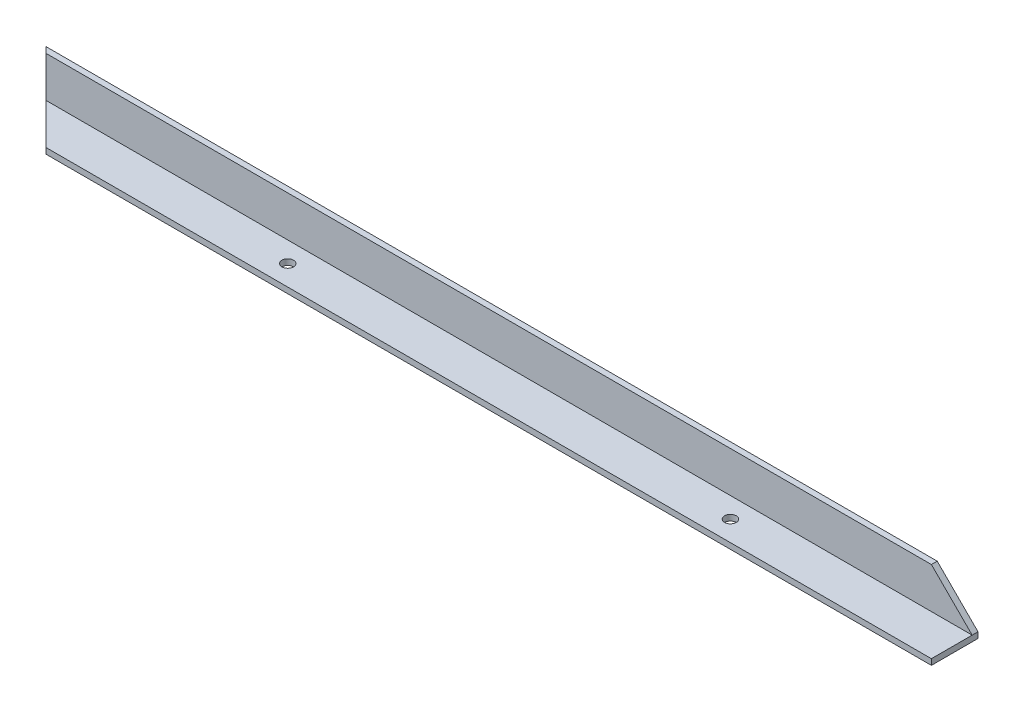
ISO-10303-21;
HEADER;
FILE_DESCRIPTION(('STEP AP214'),'2;1');
FILE_NAME('part.step','',(''),(''),'','','');
FILE_SCHEMA(('AUTOMOTIVE_DESIGN { 1 0 10303 214 1 1 1 1 }'));
ENDSEC;
DATA;
#1=APPLICATION_CONTEXT('core data for automotive mechanical design processes');
#2=APPLICATION_PROTOCOL_DEFINITION('international standard','automotive_design',2000,#1);
#3=PRODUCT_CONTEXT('',#1,'mechanical');
#4=PRODUCT('Part','Part','',(#3));
#5=PRODUCT_RELATED_PRODUCT_CATEGORY('part','',(#4));
#6=PRODUCT_DEFINITION_FORMATION('','',#4);
#7=PRODUCT_DEFINITION_CONTEXT('part definition',#1,'design');
#8=PRODUCT_DEFINITION('design','',#6,#7);
#9=PRODUCT_DEFINITION_SHAPE('','',#8);
#10=(LENGTH_UNIT() NAMED_UNIT(*) SI_UNIT(.MILLI.,.METRE.));
#11=(NAMED_UNIT(*) PLANE_ANGLE_UNIT() SI_UNIT($,.RADIAN.));
#12=(NAMED_UNIT(*) SI_UNIT($,.STERADIAN.) SOLID_ANGLE_UNIT());
#13=UNCERTAINTY_MEASURE_WITH_UNIT(LENGTH_MEASURE(1.E-05),#10,'distance_accuracy_value','');
#14=(GEOMETRIC_REPRESENTATION_CONTEXT(3) GLOBAL_UNCERTAINTY_ASSIGNED_CONTEXT((#13)) GLOBAL_UNIT_ASSIGNED_CONTEXT((#10,
#11,#12)) REPRESENTATION_CONTEXT('',''));
#15=CARTESIAN_POINT('',(0.,0.,0.));
#16=DIRECTION('',(0.,0.,1.));
#17=DIRECTION('',(1.,0.,0.));
#18=AXIS2_PLACEMENT_3D('',#15,#16,#17);
#19=CARTESIAN_POINT('',(0.,3.175,0.));
#20=DIRECTION('',(0.,-1.,0.));
#21=DIRECTION('',(0.,0.,-1.));
#22=AXIS2_PLACEMENT_3D('',#19,#20,#21);
#23=PLANE('',#22);
#24=CARTESIAN_POINT('',(-120.65,3.175,14.2874999999994));
#25=DIRECTION('',(0.,1.,0.));
#26=DIRECTION('',(0.,0.,-1.));
#27=AXIS2_PLACEMENT_3D('',#24,#25,#26);
#28=CIRCLE('',#27,3.17499999999997);
#29=CARTESIAN_POINT('',(-120.65,3.175,11.1124999999995));
#30=VERTEX_POINT('',#29);
#31=EDGE_CURVE('E239',#30,#30,#28,.T.);
#32=ORIENTED_EDGE('',*,*,#31,.F.);
#33=EDGE_LOOP('',(#32));
#34=FACE_BOUND('',#33,.T.);
#35=CARTESIAN_POINT('',(-361.95,3.175,14.2875));
#36=DIRECTION('',(0.,1.,0.));
#37=DIRECTION('',(0.,0.,1.));
#38=AXIS2_PLACEMENT_3D('',#35,#36,#37);
#39=CIRCLE('',#38,3.17499999999997);
#40=CARTESIAN_POINT('',(-361.95,3.175,17.4625));
#41=VERTEX_POINT('',#40);
#42=EDGE_CURVE('E243',#41,#41,#39,.T.);
#43=ORIENTED_EDGE('',*,*,#42,.F.);
#44=EDGE_LOOP('',(#43));
#45=FACE_BOUND('',#44,.T.);
#46=DIRECTION('',(1.,0.,0.));
#47=VECTOR('',#46,1.);
#48=CARTESIAN_POINT('',(-508.,3.175,3.175));
#49=LINE('',#48,#47);
#50=CARTESIAN_POINT('',(-504.825,3.175,3.175));
#51=VERTEX_POINT('',#50);
#52=CARTESIAN_POINT('',(0.,3.175,3.175));
#53=VERTEX_POINT('',#52);
#54=EDGE_CURVE('E109',#51,#53,#49,.T.);
#55=ORIENTED_EDGE('',*,*,#54,.F.);
#56=DIRECTION('',(0.707106781186551,0.,0.707106781186544));
#57=VECTOR('',#56,1.);
#58=CARTESIAN_POINT('',(-253.999999999997,3.175,254.));
#59=LINE('',#58,#57);
#60=CARTESIAN_POINT('',(-482.6,3.175,25.4));
#61=VERTEX_POINT('',#60);
#62=EDGE_CURVE('E151',#51,#61,#59,.T.);
#63=ORIENTED_EDGE('',*,*,#62,.T.);
#64=DIRECTION('',(1.,0.,0.));
#65=VECTOR('',#64,1.);
#66=CARTESIAN_POINT('',(0.,3.175,25.4));
#67=LINE('',#66,#65);
#68=CARTESIAN_POINT('',(0.,3.175,25.4));
#69=VERTEX_POINT('',#68);
#70=EDGE_CURVE('E117',#61,#69,#67,.T.);
#71=ORIENTED_EDGE('',*,*,#70,.T.);
#72=DIRECTION('',(0.,0.,-1.));
#73=VECTOR('',#72,1.);
#74=CARTESIAN_POINT('',(0.,3.175,0.));
#75=LINE('',#74,#73);
#76=EDGE_CURVE('E104',#69,#53,#75,.T.);
#77=ORIENTED_EDGE('',*,*,#76,.T.);
#78=EDGE_LOOP('',(#55,#63,#71,#77));
#79=FACE_BOUND('',#78,.T.);
#80=ADVANCED_FACE('F35',(#34,#45,#79),#23,.F.);
#81=CARTESIAN_POINT('',(0.,3.175,0.));
#82=DIRECTION('',(-1.,0.,0.));
#83=DIRECTION('',(0.,0.,1.));
#84=AXIS2_PLACEMENT_3D('',#81,#82,#83);
#85=PLANE('',#84);
#86=DIRECTION('',(0.,-1.,0.));
#87=VECTOR('',#86,1.);
#88=CARTESIAN_POINT('',(0.,3.175,0.));
#89=LINE('',#88,#87);
#90=CARTESIAN_POINT('',(0.,3.175,0.));
#91=VERTEX_POINT('',#90);
#92=CARTESIAN_POINT('',(0.,0.,0.));
#93=VERTEX_POINT('',#92);
#94=EDGE_CURVE('E106',#91,#93,#89,.T.);
#95=ORIENTED_EDGE('',*,*,#94,.F.);
#96=DIRECTION('',(0.,0.,1.));
#97=VECTOR('',#96,1.);
#98=CARTESIAN_POINT('',(0.,3.175,-19.05));
#99=LINE('',#98,#97);
#100=EDGE_CURVE('E92',#91,#53,#99,.T.);
#101=ORIENTED_EDGE('',*,*,#100,.T.);
#102=ORIENTED_EDGE('',*,*,#76,.F.);
#103=DIRECTION('',(0.,-1.,0.));
#104=VECTOR('',#103,1.);
#105=CARTESIAN_POINT('',(0.,3.175,25.4));
#106=LINE('',#105,#104);
#107=CARTESIAN_POINT('',(0.,0.,25.4));
#108=VERTEX_POINT('',#107);
#109=EDGE_CURVE('E121',#69,#108,#106,.T.);
#110=ORIENTED_EDGE('',*,*,#109,.T.);
#111=DIRECTION('',(0.,0.,-1.));
#112=VECTOR('',#111,1.);
#113=CARTESIAN_POINT('',(0.,0.,0.));
#114=LINE('',#113,#112);
#115=EDGE_CURVE('E127',#108,#93,#114,.T.);
#116=ORIENTED_EDGE('',*,*,#115,.T.);
#117=EDGE_LOOP('',(#95,#101,#102,#110,#116));
#118=FACE_BOUND('',#117,.T.);
#119=ADVANCED_FACE('F37',(#118),#85,.F.);
#120=CARTESIAN_POINT('',(0.,3.175,0.));
#121=DIRECTION('',(0.,0.,1.));
#122=DIRECTION('',(1.,0.,0.));
#123=AXIS2_PLACEMENT_3D('',#120,#121,#122);
#124=PLANE('',#123);
#125=DIRECTION('',(-1.,0.,0.));
#126=VECTOR('',#125,1.);
#127=CARTESIAN_POINT('',(-508.,25.4,0.));
#128=LINE('',#127,#126);
#129=CARTESIAN_POINT('',(-22.2250000000002,25.4,0.));
#130=VERTEX_POINT('',#129);
#131=CARTESIAN_POINT('',(-508.,25.4,0.));
#132=VERTEX_POINT('',#131);
#133=EDGE_CURVE('E129',#130,#132,#128,.T.);
#134=ORIENTED_EDGE('',*,*,#133,.F.);
#135=DIRECTION('',(0.707106781186551,-0.707106781186544,0.));
#136=VECTOR('',#135,1.);
#137=CARTESIAN_POINT('',(0.,3.175,0.));
#138=LINE('',#137,#136);
#139=EDGE_CURVE('E49',#130,#91,#138,.T.);
#140=ORIENTED_EDGE('',*,*,#139,.T.);
#141=ORIENTED_EDGE('',*,*,#94,.T.);
#142=DIRECTION('',(-1.,0.,0.));
#143=VECTOR('',#142,1.);
#144=CARTESIAN_POINT('',(0.,0.,0.));
#145=LINE('',#144,#143);
#146=CARTESIAN_POINT('',(-508.,0.,0.));
#147=VERTEX_POINT('',#146);
#148=EDGE_CURVE('E123',#93,#147,#145,.T.);
#149=ORIENTED_EDGE('',*,*,#148,.T.);
#150=DIRECTION('',(0.,-1.,0.));
#151=VECTOR('',#150,1.);
#152=CARTESIAN_POINT('',(-508.,3.175,0.));
#153=LINE('',#152,#151);
#154=EDGE_CURVE('E133',#132,#147,#153,.T.);
#155=ORIENTED_EDGE('',*,*,#154,.F.);
#156=EDGE_LOOP('',(#134,#140,#141,#149,#155));
#157=FACE_BOUND('',#156,.T.);
#158=ADVANCED_FACE('F141',(#157),#124,.F.);
#159=CARTESIAN_POINT('',(0.,3.175,25.4));
#160=DIRECTION('',(0.,0.,-1.));
#161=DIRECTION('',(-1.,0.,0.));
#162=AXIS2_PLACEMENT_3D('',#159,#160,#161);
#163=PLANE('',#162);
#164=ORIENTED_EDGE('',*,*,#70,.F.);
#165=DIRECTION('',(0.,-1.,0.));
#166=VECTOR('',#165,1.);
#167=CARTESIAN_POINT('',(-482.6,3.175,25.4));
#168=LINE('',#167,#166);
#169=CARTESIAN_POINT('',(-482.6,0.,25.4));
#170=VERTEX_POINT('',#169);
#171=EDGE_CURVE('E114',#61,#170,#168,.T.);
#172=ORIENTED_EDGE('',*,*,#171,.T.);
#173=DIRECTION('',(1.,0.,0.));
#174=VECTOR('',#173,1.);
#175=CARTESIAN_POINT('',(0.,0.,25.4));
#176=LINE('',#175,#174);
#177=EDGE_CURVE('E119',#170,#108,#176,.T.);
#178=ORIENTED_EDGE('',*,*,#177,.T.);
#179=ORIENTED_EDGE('',*,*,#109,.F.);
#180=EDGE_LOOP('',(#164,#172,#178,#179));
#181=FACE_BOUND('',#180,.T.);
#182=ADVANCED_FACE('F149',(#181),#163,.F.);
#183=CARTESIAN_POINT('',(0.,0.,0.));
#184=DIRECTION('',(0.,-1.,0.));
#185=DIRECTION('',(0.,0.,-1.));
#186=AXIS2_PLACEMENT_3D('',#183,#184,#185);
#187=PLANE('',#186);
#188=CARTESIAN_POINT('',(-120.65,0.,14.2874999999994));
#189=DIRECTION('',(0.,-1.,0.));
#190=DIRECTION('',(0.,0.,-1.));
#191=AXIS2_PLACEMENT_3D('',#188,#189,#190);
#192=CIRCLE('',#191,3.17499999999997);
#193=CARTESIAN_POINT('',(-120.65,0.,11.1124999999995));
#194=VERTEX_POINT('',#193);
#195=EDGE_CURVE('E242',#194,#194,#192,.F.);
#196=ORIENTED_EDGE('',*,*,#195,.T.);
#197=EDGE_LOOP('',(#196));
#198=FACE_BOUND('',#197,.T.);
#199=CARTESIAN_POINT('',(-361.95,0.,14.2875));
#200=DIRECTION('',(0.,-1.,0.));
#201=DIRECTION('',(0.,0.,-1.));
#202=AXIS2_PLACEMENT_3D('',#199,#200,#201);
#203=CIRCLE('',#202,3.17499999999997);
#204=CARTESIAN_POINT('',(-361.95,0.,11.1125000000001));
#205=VERTEX_POINT('',#204);
#206=EDGE_CURVE('E97',#205,#205,#203,.F.);
#207=ORIENTED_EDGE('',*,*,#206,.T.);
#208=EDGE_LOOP('',(#207));
#209=FACE_BOUND('',#208,.T.);
#210=DIRECTION('',(-0.707106781186551,0.,-0.707106781186544));
#211=VECTOR('',#210,1.);
#212=CARTESIAN_POINT('',(-508.,0.,0.));
#213=LINE('',#212,#211);
#214=EDGE_CURVE('E147',#170,#147,#213,.T.);
#215=ORIENTED_EDGE('',*,*,#214,.T.);
#216=ORIENTED_EDGE('',*,*,#148,.F.);
#217=ORIENTED_EDGE('',*,*,#115,.F.);
#218=ORIENTED_EDGE('',*,*,#177,.F.);
#219=EDGE_LOOP('',(#215,#216,#217,#218));
#220=FACE_BOUND('',#219,.T.);
#221=ADVANCED_FACE('F145',(#198,#209,#220),#187,.T.);
#222=CARTESIAN_POINT('',(-508.,25.4,3.175));
#223=DIRECTION('',(0.,0.,-1.));
#224=DIRECTION('',(-1.,0.,0.));
#225=AXIS2_PLACEMENT_3D('',#222,#223,#224);
#226=PLANE('',#225);
#227=ORIENTED_EDGE('',*,*,#54,.T.);
#228=DIRECTION('',(0.707106781186551,-0.707106781186544,0.));
#229=VECTOR('',#228,1.);
#230=CARTESIAN_POINT('',(0.,3.175,3.175));
#231=LINE('',#230,#229);
#232=CARTESIAN_POINT('',(-22.2250000000002,25.4,3.175));
#233=VERTEX_POINT('',#232);
#234=EDGE_CURVE('E89',#233,#53,#231,.T.);
#235=ORIENTED_EDGE('',*,*,#234,.F.);
#236=DIRECTION('',(1.,0.,0.));
#237=VECTOR('',#236,1.);
#238=CARTESIAN_POINT('',(-508.,25.4,3.175));
#239=LINE('',#238,#237);
#240=CARTESIAN_POINT('',(-504.825,25.4,3.17499999999991));
#241=VERTEX_POINT('',#240);
#242=EDGE_CURVE('E113',#241,#233,#239,.T.);
#243=ORIENTED_EDGE('',*,*,#242,.F.);
#244=DIRECTION('',(0.,-1.,0.));
#245=VECTOR('',#244,1.);
#246=CARTESIAN_POINT('',(-504.825,25.4,3.175));
#247=LINE('',#246,#245);
#248=EDGE_CURVE('E57',#241,#51,#247,.T.);
#249=ORIENTED_EDGE('',*,*,#248,.T.);
#250=EDGE_LOOP('',(#227,#235,#243,#249));
#251=FACE_BOUND('',#250,.T.);
#252=ADVANCED_FACE('F110',(#251),#226,.F.);
#253=CARTESIAN_POINT('',(0.,25.4,0.));
#254=DIRECTION('',(0.,1.,0.));
#255=DIRECTION('',(0.,0.,1.));
#256=AXIS2_PLACEMENT_3D('',#253,#254,#255);
#257=PLANE('',#256);
#258=DIRECTION('',(0.,0.,1.));
#259=VECTOR('',#258,1.);
#260=CARTESIAN_POINT('',(-22.2250000000002,25.4,0.));
#261=LINE('',#260,#259);
#262=EDGE_CURVE('E11',#130,#233,#261,.T.);
#263=ORIENTED_EDGE('',*,*,#262,.F.);
#264=ORIENTED_EDGE('',*,*,#133,.T.);
#265=DIRECTION('',(-0.707106781186551,0.,-0.707106781186544));
#266=VECTOR('',#265,1.);
#267=CARTESIAN_POINT('',(-253.999999999997,25.4,254.));
#268=LINE('',#267,#266);
#269=EDGE_CURVE('E43',#241,#132,#268,.T.);
#270=ORIENTED_EDGE('',*,*,#269,.F.);
#271=ORIENTED_EDGE('',*,*,#242,.T.);
#272=EDGE_LOOP('',(#263,#264,#270,#271));
#273=FACE_BOUND('',#272,.T.);
#274=ADVANCED_FACE('F156',(#273),#257,.T.);
#275=CARTESIAN_POINT('',(-508.,-73.6812421241363,0.));
#276=DIRECTION('',(0.707106781186544,0.,-0.707106781186551));
#277=DIRECTION('',(-0.707106781186551,0.,-0.707106781186544));
#278=AXIS2_PLACEMENT_3D('',#275,#276,#277);
#279=PLANE('',#278);
#280=ORIENTED_EDGE('',*,*,#62,.F.);
#281=ORIENTED_EDGE('',*,*,#248,.F.);
#282=ORIENTED_EDGE('',*,*,#269,.T.);
#283=ORIENTED_EDGE('',*,*,#154,.T.);
#284=ORIENTED_EDGE('',*,*,#214,.F.);
#285=ORIENTED_EDGE('',*,*,#171,.F.);
#286=EDGE_LOOP('',(#280,#281,#282,#283,#284,#285));
#287=FACE_BOUND('',#286,.T.);
#288=ADVANCED_FACE('F136',(#287),#279,.F.);
#289=CARTESIAN_POINT('',(0.,3.175,-19.05));
#290=DIRECTION('',(-0.707106781186544,-0.707106781186551,0.));
#291=DIRECTION('',(0.707106781186551,-0.707106781186544,0.));
#292=AXIS2_PLACEMENT_3D('',#289,#290,#291);
#293=PLANE('',#292);
#294=ORIENTED_EDGE('',*,*,#262,.T.);
#295=ORIENTED_EDGE('',*,*,#234,.T.);
#296=ORIENTED_EDGE('',*,*,#100,.F.);
#297=ORIENTED_EDGE('',*,*,#139,.F.);
#298=EDGE_LOOP('',(#294,#295,#296,#297));
#299=FACE_BOUND('',#298,.T.);
#300=ADVANCED_FACE('F91',(#299),#293,.F.);
#301=CARTESIAN_POINT('',(-361.95,-8.98025612106909,14.2875));
#302=DIRECTION('',(0.,1.,0.));
#303=DIRECTION('',(0.,0.,1.));
#304=AXIS2_PLACEMENT_3D('',#301,#302,#303);
#305=CYLINDRICAL_SURFACE('',#304,3.17499999999997);
#306=ORIENTED_EDGE('',*,*,#42,.T.);
#307=EDGE_LOOP('',(#306));
#308=FACE_BOUND('',#307,.T.);
#309=ORIENTED_EDGE('',*,*,#206,.F.);
#310=EDGE_LOOP('',(#309));
#311=FACE_BOUND('',#310,.T.);
#312=ADVANCED_FACE('F213',(#308,#311),#305,.F.);
#313=CARTESIAN_POINT('',(-120.65,-8.98025612106909,14.2874999999994));
#314=DIRECTION('',(0.,1.,0.));
#315=DIRECTION('',(0.,0.,1.));
#316=AXIS2_PLACEMENT_3D('',#313,#314,#315);
#317=CYLINDRICAL_SURFACE('',#316,3.17499999999997);
#318=ORIENTED_EDGE('',*,*,#31,.T.);
#319=EDGE_LOOP('',(#318));
#320=FACE_BOUND('',#319,.T.);
#321=ORIENTED_EDGE('',*,*,#195,.F.);
#322=EDGE_LOOP('',(#321));
#323=FACE_BOUND('',#322,.T.);
#324=ADVANCED_FACE('F223',(#320,#323),#317,.F.);
#325=CLOSED_SHELL('',(#80,#119,#158,#182,#221,#252,#274,#288,#300,#312,#324));
#326=MANIFOLD_SOLID_BREP('B2',#325);
#327=ADVANCED_BREP_SHAPE_REPRESENTATION('',(#18,#326),#14);
#328=SHAPE_DEFINITION_REPRESENTATION(#9,#327);
ENDSEC;
END-ISO-10303-21;
